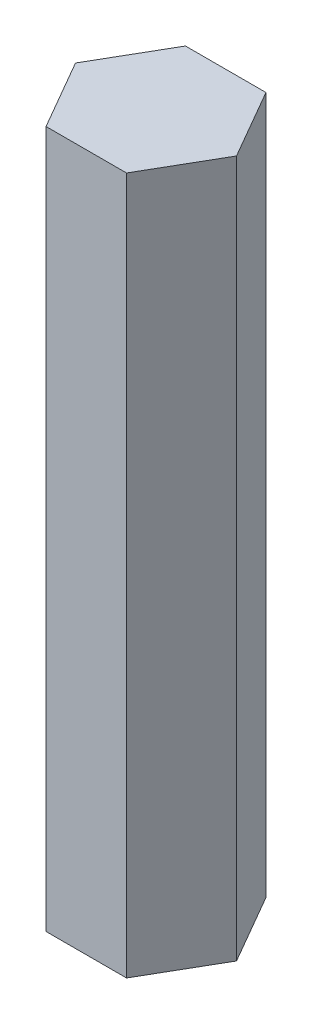
ISO-10303-21;
HEADER;
FILE_DESCRIPTION(('STEP AP214'),'2;1');
FILE_NAME('part.step','',(''),(''),'','','');
FILE_SCHEMA(('AUTOMOTIVE_DESIGN { 1 0 10303 214 1 1 1 1 }'));
ENDSEC;
DATA;
#1=APPLICATION_CONTEXT('core data for automotive mechanical design processes');
#2=APPLICATION_PROTOCOL_DEFINITION('international standard','automotive_design',2000,#1);
#3=PRODUCT_CONTEXT('',#1,'mechanical');
#4=PRODUCT('Part','Part','',(#3));
#5=PRODUCT_RELATED_PRODUCT_CATEGORY('part','',(#4));
#6=PRODUCT_DEFINITION_FORMATION('','',#4);
#7=PRODUCT_DEFINITION_CONTEXT('part definition',#1,'design');
#8=PRODUCT_DEFINITION('design','',#6,#7);
#9=PRODUCT_DEFINITION_SHAPE('','',#8);
#10=(LENGTH_UNIT() NAMED_UNIT(*) SI_UNIT(.MILLI.,.METRE.));
#11=(NAMED_UNIT(*) PLANE_ANGLE_UNIT() SI_UNIT($,.RADIAN.));
#12=(NAMED_UNIT(*) SI_UNIT($,.STERADIAN.) SOLID_ANGLE_UNIT());
#13=UNCERTAINTY_MEASURE_WITH_UNIT(LENGTH_MEASURE(1.E-05),#10,'distance_accuracy_value','');
#14=(GEOMETRIC_REPRESENTATION_CONTEXT(3) GLOBAL_UNCERTAINTY_ASSIGNED_CONTEXT((#13)) GLOBAL_UNIT_ASSIGNED_CONTEXT((#10,
#11,#12)) REPRESENTATION_CONTEXT('',''));
#15=CARTESIAN_POINT('',(0.,0.,0.));
#16=DIRECTION('',(0.,0.,1.));
#17=DIRECTION('',(1.,0.,0.));
#18=AXIS2_PLACEMENT_3D('',#15,#16,#17);
#19=CARTESIAN_POINT('',(5.77350269189632,100.,-10.));
#20=DIRECTION('',(0.,0.,1.));
#21=DIRECTION('',(1.,0.,0.));
#22=AXIS2_PLACEMENT_3D('',#19,#20,#21);
#23=PLANE('',#22);
#24=DIRECTION('',(-1.,0.,0.));
#25=VECTOR('',#24,1.);
#26=CARTESIAN_POINT('',(5.77350269189632,0.,-10.));
#27=LINE('',#26,#25);
#28=CARTESIAN_POINT('',(5.77350269189632,0.,-10.));
#29=VERTEX_POINT('',#28);
#30=CARTESIAN_POINT('',(-5.77350269189625,0.,-10.));
#31=VERTEX_POINT('',#30);
#32=EDGE_CURVE('E125',#29,#31,#27,.T.);
#33=ORIENTED_EDGE('',*,*,#32,.T.);
#34=DIRECTION('',(0.,-1.,0.));
#35=VECTOR('',#34,1.);
#36=CARTESIAN_POINT('',(-5.77350269189625,100.,-10.));
#37=LINE('',#36,#35);
#38=CARTESIAN_POINT('',(-5.77350269189625,100.,-10.));
#39=VERTEX_POINT('',#38);
#40=EDGE_CURVE('E11',#39,#31,#37,.T.);
#41=ORIENTED_EDGE('',*,*,#40,.F.);
#42=DIRECTION('',(-1.,0.,0.));
#43=VECTOR('',#42,1.);
#44=CARTESIAN_POINT('',(5.77350269189632,100.,-10.));
#45=LINE('',#44,#43);
#46=CARTESIAN_POINT('',(5.77350269189632,100.,-10.));
#47=VERTEX_POINT('',#46);
#48=EDGE_CURVE('E135',#47,#39,#45,.T.);
#49=ORIENTED_EDGE('',*,*,#48,.F.);
#50=DIRECTION('',(0.,-1.,0.));
#51=VECTOR('',#50,1.);
#52=CARTESIAN_POINT('',(5.77350269189632,100.,-10.));
#53=LINE('',#52,#51);
#54=EDGE_CURVE('E121',#47,#29,#53,.T.);
#55=ORIENTED_EDGE('',*,*,#54,.T.);
#56=EDGE_LOOP('',(#33,#41,#49,#55));
#57=FACE_BOUND('',#56,.T.);
#58=ADVANCED_FACE('F41',(#57),#23,.F.);
#59=CARTESIAN_POINT('',(-5.77350269189625,100.,-10.));
#60=DIRECTION('',(0.866025403784438,0.,0.500000000000001));
#61=DIRECTION('',(0.500000000000001,0.,-0.866025403784438));
#62=AXIS2_PLACEMENT_3D('',#59,#60,#61);
#63=PLANE('',#62);
#64=DIRECTION('',(-0.500000000000001,0.,0.866025403784438));
#65=VECTOR('',#64,1.);
#66=CARTESIAN_POINT('',(-5.77350269189625,0.,-10.));
#67=LINE('',#66,#65);
#68=CARTESIAN_POINT('',(-11.5470053837925,0.,0.));
#69=VERTEX_POINT('',#68);
#70=EDGE_CURVE('E128',#31,#69,#67,.T.);
#71=ORIENTED_EDGE('',*,*,#70,.T.);
#72=DIRECTION('',(0.,-1.,0.));
#73=VECTOR('',#72,1.);
#74=CARTESIAN_POINT('',(-11.5470053837925,100.,0.));
#75=LINE('',#74,#73);
#76=CARTESIAN_POINT('',(-11.5470053837925,100.,0.));
#77=VERTEX_POINT('',#76);
#78=EDGE_CURVE('E49',#77,#69,#75,.T.);
#79=ORIENTED_EDGE('',*,*,#78,.F.);
#80=DIRECTION('',(-0.500000000000001,0.,0.866025403784438));
#81=VECTOR('',#80,1.);
#82=CARTESIAN_POINT('',(-5.77350269189625,100.,-10.));
#83=LINE('',#82,#81);
#84=EDGE_CURVE('E94',#39,#77,#83,.T.);
#85=ORIENTED_EDGE('',*,*,#84,.F.);
#86=ORIENTED_EDGE('',*,*,#40,.T.);
#87=EDGE_LOOP('',(#71,#79,#85,#86));
#88=FACE_BOUND('',#87,.T.);
#89=ADVANCED_FACE('F159',(#88),#63,.F.);
#90=CARTESIAN_POINT('',(-11.5470053837925,100.,0.));
#91=DIRECTION('',(0.866025403784438,0.,-0.5));
#92=DIRECTION('',(-0.5,0.,-0.866025403784439));
#93=AXIS2_PLACEMENT_3D('',#90,#91,#92);
#94=PLANE('',#93);
#95=DIRECTION('',(0.5,0.,0.866025403784438));
#96=VECTOR('',#95,1.);
#97=CARTESIAN_POINT('',(-11.5470053837925,0.,0.));
#98=LINE('',#97,#96);
#99=CARTESIAN_POINT('',(-5.77350269189626,0.,10.));
#100=VERTEX_POINT('',#99);
#101=EDGE_CURVE('E130',#69,#100,#98,.T.);
#102=ORIENTED_EDGE('',*,*,#101,.T.);
#103=DIRECTION('',(0.,-1.,0.));
#104=VECTOR('',#103,1.);
#105=CARTESIAN_POINT('',(-5.77350269189626,100.,10.));
#106=LINE('',#105,#104);
#107=CARTESIAN_POINT('',(-5.77350269189626,100.,10.));
#108=VERTEX_POINT('',#107);
#109=EDGE_CURVE('E116',#108,#100,#106,.T.);
#110=ORIENTED_EDGE('',*,*,#109,.F.);
#111=DIRECTION('',(0.5,0.,0.866025403784438));
#112=VECTOR('',#111,1.);
#113=CARTESIAN_POINT('',(-11.5470053837925,100.,0.));
#114=LINE('',#113,#112);
#115=EDGE_CURVE('E107',#77,#108,#114,.T.);
#116=ORIENTED_EDGE('',*,*,#115,.F.);
#117=ORIENTED_EDGE('',*,*,#78,.T.);
#118=EDGE_LOOP('',(#102,#110,#116,#117));
#119=FACE_BOUND('',#118,.T.);
#120=ADVANCED_FACE('F141',(#119),#94,.F.);
#121=CARTESIAN_POINT('',(-5.77350269189626,100.,10.));
#122=DIRECTION('',(0.,0.,-1.));
#123=DIRECTION('',(-1.,0.,0.));
#124=AXIS2_PLACEMENT_3D('',#121,#122,#123);
#125=PLANE('',#124);
#126=DIRECTION('',(1.,0.,0.));
#127=VECTOR('',#126,1.);
#128=CARTESIAN_POINT('',(-5.77350269189626,0.,10.));
#129=LINE('',#128,#127);
#130=CARTESIAN_POINT('',(5.7735026918963,0.,9.99999999999998));
#131=VERTEX_POINT('',#130);
#132=EDGE_CURVE('E115',#100,#131,#129,.T.);
#133=ORIENTED_EDGE('',*,*,#132,.T.);
#134=DIRECTION('',(0.,-1.,0.));
#135=VECTOR('',#134,1.);
#136=CARTESIAN_POINT('',(5.7735026918963,100.,9.99999999999998));
#137=LINE('',#136,#135);
#138=CARTESIAN_POINT('',(5.7735026918963,100.,9.99999999999998));
#139=VERTEX_POINT('',#138);
#140=EDGE_CURVE('E112',#139,#131,#137,.T.);
#141=ORIENTED_EDGE('',*,*,#140,.F.);
#142=DIRECTION('',(1.,0.,0.));
#143=VECTOR('',#142,1.);
#144=CARTESIAN_POINT('',(-5.77350269189626,100.,10.));
#145=LINE('',#144,#143);
#146=EDGE_CURVE('E101',#108,#139,#145,.T.);
#147=ORIENTED_EDGE('',*,*,#146,.F.);
#148=ORIENTED_EDGE('',*,*,#109,.T.);
#149=EDGE_LOOP('',(#133,#141,#147,#148));
#150=FACE_BOUND('',#149,.T.);
#151=ADVANCED_FACE('F113',(#150),#125,.F.);
#152=CARTESIAN_POINT('',(5.7735026918963,100.,9.99999999999998));
#153=DIRECTION('',(-0.86602540378444,0.,-0.499999999999998));
#154=DIRECTION('',(-0.499999999999998,0.,0.86602540378444));
#155=AXIS2_PLACEMENT_3D('',#152,#153,#154);
#156=PLANE('',#155);
#157=DIRECTION('',(0.499999999999998,0.,-0.86602540378444));
#158=VECTOR('',#157,1.);
#159=CARTESIAN_POINT('',(5.7735026918963,0.,9.99999999999998));
#160=LINE('',#159,#158);
#161=CARTESIAN_POINT('',(11.5470053837926,0.,0.));
#162=VERTEX_POINT('',#161);
#163=EDGE_CURVE('E80',#131,#162,#160,.T.);
#164=ORIENTED_EDGE('',*,*,#163,.T.);
#165=DIRECTION('',(0.,-1.,0.));
#166=VECTOR('',#165,1.);
#167=CARTESIAN_POINT('',(11.5470053837926,100.,0.));
#168=LINE('',#167,#166);
#169=CARTESIAN_POINT('',(11.5470053837926,100.,0.));
#170=VERTEX_POINT('',#169);
#171=EDGE_CURVE('E117',#170,#162,#168,.T.);
#172=ORIENTED_EDGE('',*,*,#171,.F.);
#173=DIRECTION('',(0.499999999999998,0.,-0.86602540378444));
#174=VECTOR('',#173,1.);
#175=CARTESIAN_POINT('',(5.7735026918963,100.,9.99999999999998));
#176=LINE('',#175,#174);
#177=EDGE_CURVE('E105',#139,#170,#176,.T.);
#178=ORIENTED_EDGE('',*,*,#177,.F.);
#179=ORIENTED_EDGE('',*,*,#140,.T.);
#180=EDGE_LOOP('',(#164,#172,#178,#179));
#181=FACE_BOUND('',#180,.T.);
#182=ADVANCED_FACE('F119',(#181),#156,.F.);
#183=CARTESIAN_POINT('',(11.5470053837926,100.,0.));
#184=DIRECTION('',(-0.866025403784439,0.,0.5));
#185=DIRECTION('',(0.5,0.,0.866025403784439));
#186=AXIS2_PLACEMENT_3D('',#183,#184,#185);
#187=PLANE('',#186);
#188=DIRECTION('',(-0.5,0.,-0.866025403784439));
#189=VECTOR('',#188,1.);
#190=CARTESIAN_POINT('',(11.5470053837926,0.,0.));
#191=LINE('',#190,#189);
#192=EDGE_CURVE('E86',#162,#29,#191,.T.);
#193=ORIENTED_EDGE('',*,*,#192,.T.);
#194=ORIENTED_EDGE('',*,*,#54,.F.);
#195=DIRECTION('',(-0.5,0.,-0.866025403784439));
#196=VECTOR('',#195,1.);
#197=CARTESIAN_POINT('',(11.5470053837926,100.,0.));
#198=LINE('',#197,#196);
#199=EDGE_CURVE('E57',#170,#47,#198,.T.);
#200=ORIENTED_EDGE('',*,*,#199,.F.);
#201=ORIENTED_EDGE('',*,*,#171,.T.);
#202=EDGE_LOOP('',(#193,#194,#200,#201));
#203=FACE_BOUND('',#202,.T.);
#204=ADVANCED_FACE('F148',(#203),#187,.F.);
#205=CARTESIAN_POINT('',(0.,100.,0.));
#206=DIRECTION('',(0.,1.,0.));
#207=DIRECTION('',(0.,0.,1.));
#208=AXIS2_PLACEMENT_3D('',#205,#206,#207);
#209=PLANE('',#208);
#210=ORIENTED_EDGE('',*,*,#48,.T.);
#211=ORIENTED_EDGE('',*,*,#84,.T.);
#212=ORIENTED_EDGE('',*,*,#115,.T.);
#213=ORIENTED_EDGE('',*,*,#146,.T.);
#214=ORIENTED_EDGE('',*,*,#177,.T.);
#215=ORIENTED_EDGE('',*,*,#199,.T.);
#216=EDGE_LOOP('',(#210,#211,#212,#213,#214,#215));
#217=FACE_BOUND('',#216,.T.);
#218=ADVANCED_FACE('F103',(#217),#209,.T.);
#219=CARTESIAN_POINT('',(0.,0.,0.));
#220=DIRECTION('',(0.,1.,0.));
#221=DIRECTION('',(0.,0.,1.));
#222=AXIS2_PLACEMENT_3D('',#219,#220,#221);
#223=PLANE('',#222);
#224=ORIENTED_EDGE('',*,*,#32,.F.);
#225=ORIENTED_EDGE('',*,*,#192,.F.);
#226=ORIENTED_EDGE('',*,*,#163,.F.);
#227=ORIENTED_EDGE('',*,*,#132,.F.);
#228=ORIENTED_EDGE('',*,*,#101,.F.);
#229=ORIENTED_EDGE('',*,*,#70,.F.);
#230=EDGE_LOOP('',(#224,#225,#226,#227,#228,#229));
#231=FACE_BOUND('',#230,.T.);
#232=ADVANCED_FACE('F144',(#231),#223,.F.);
#233=CLOSED_SHELL('',(#58,#89,#120,#151,#182,#204,#218,#232));
#234=MANIFOLD_SOLID_BREP('B2',#233);
#235=ADVANCED_BREP_SHAPE_REPRESENTATION('',(#18,#234),#14);
#236=SHAPE_DEFINITION_REPRESENTATION(#9,#235);
ENDSEC;
END-ISO-10303-21;
